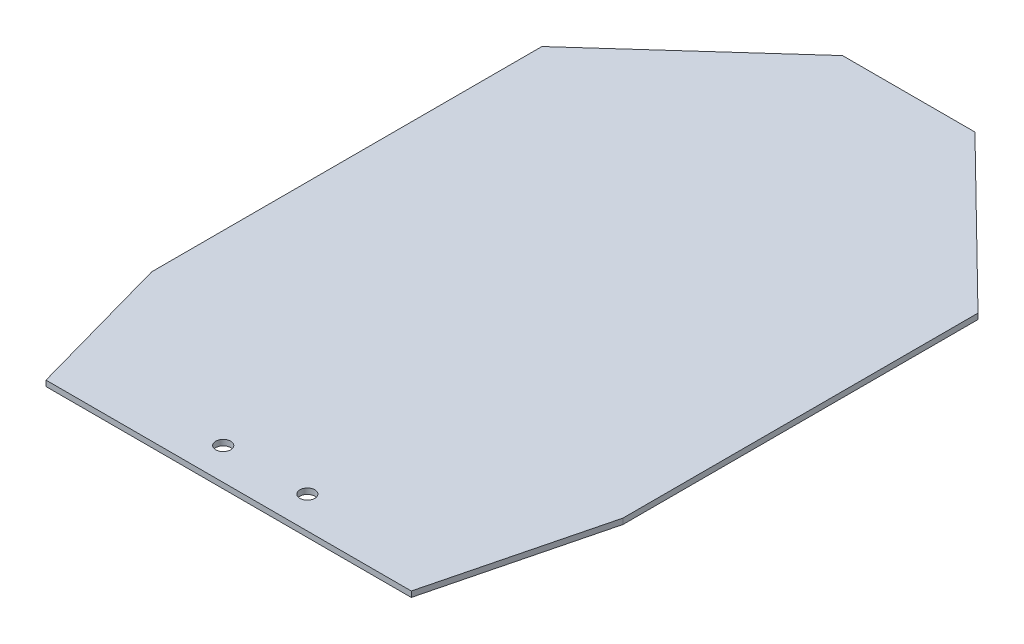
ISO-10303-21;
HEADER;
FILE_DESCRIPTION(('STEP AP214'),'2;1');
FILE_NAME('part.step','',(''),(''),'','','');
FILE_SCHEMA(('AUTOMOTIVE_DESIGN { 1 0 10303 214 1 1 1 1 }'));
ENDSEC;
DATA;
#1=APPLICATION_CONTEXT('core data for automotive mechanical design processes');
#2=APPLICATION_PROTOCOL_DEFINITION('international standard','automotive_design',2000,#1);
#3=PRODUCT_CONTEXT('',#1,'mechanical');
#4=PRODUCT('Part','Part','',(#3));
#5=PRODUCT_RELATED_PRODUCT_CATEGORY('part','',(#4));
#6=PRODUCT_DEFINITION_FORMATION('','',#4);
#7=PRODUCT_DEFINITION_CONTEXT('part definition',#1,'design');
#8=PRODUCT_DEFINITION('design','',#6,#7);
#9=PRODUCT_DEFINITION_SHAPE('','',#8);
#10=(LENGTH_UNIT() NAMED_UNIT(*) SI_UNIT(.MILLI.,.METRE.));
#11=(NAMED_UNIT(*) PLANE_ANGLE_UNIT() SI_UNIT($,.RADIAN.));
#12=(NAMED_UNIT(*) SI_UNIT($,.STERADIAN.) SOLID_ANGLE_UNIT());
#13=UNCERTAINTY_MEASURE_WITH_UNIT(LENGTH_MEASURE(1.E-05),#10,'distance_accuracy_value','');
#14=(GEOMETRIC_REPRESENTATION_CONTEXT(3) GLOBAL_UNCERTAINTY_ASSIGNED_CONTEXT((#13)) GLOBAL_UNIT_ASSIGNED_CONTEXT((#10,
#11,#12)) REPRESENTATION_CONTEXT('',''));
#15=CARTESIAN_POINT('',(0.,0.,0.));
#16=DIRECTION('',(0.,0.,1.));
#17=DIRECTION('',(1.,0.,0.));
#18=AXIS2_PLACEMENT_3D('',#15,#16,#17);
#19=CARTESIAN_POINT('',(120.079758062847,3.,-97.5120654494727));
#20=DIRECTION('',(-0.700151218807144,0.,0.713994587376452));
#21=DIRECTION('',(0.713994587376452,0.,0.700151218807144));
#22=AXIS2_PLACEMENT_3D('',#19,#20,#21);
#23=PLANE('',#22);
#24=DIRECTION('',(-0.713994587376452,0.,-0.700151218807144));
#25=VECTOR('',#24,1.);
#26=CARTESIAN_POINT('',(120.079758062847,0.,-97.5120654494727));
#27=LINE('',#26,#25);
#28=CARTESIAN_POINT('',(120.079758062847,0.,-97.5120654494727));
#29=VERTEX_POINT('',#28);
#30=CARTESIAN_POINT('',(35.4,0.,-180.55));
#31=VERTEX_POINT('',#30);
#32=EDGE_CURVE('E133',#29,#31,#27,.T.);
#33=ORIENTED_EDGE('',*,*,#32,.T.);
#34=DIRECTION('',(0.,-1.,0.));
#35=VECTOR('',#34,1.);
#36=CARTESIAN_POINT('',(35.4,3.,-180.55));
#37=LINE('',#36,#35);
#38=CARTESIAN_POINT('',(35.4,3.,-180.55));
#39=VERTEX_POINT('',#38);
#40=EDGE_CURVE('E11',#39,#31,#37,.T.);
#41=ORIENTED_EDGE('',*,*,#40,.F.);
#42=DIRECTION('',(-0.713994587376452,0.,-0.700151218807144));
#43=VECTOR('',#42,1.);
#44=CARTESIAN_POINT('',(120.079758062847,3.,-97.5120654494727));
#45=LINE('',#44,#43);
#46=CARTESIAN_POINT('',(120.079758062847,3.,-97.5120654494727));
#47=VERTEX_POINT('',#46);
#48=EDGE_CURVE('E148',#47,#39,#45,.T.);
#49=ORIENTED_EDGE('',*,*,#48,.F.);
#50=DIRECTION('',(0.,-1.,0.));
#51=VECTOR('',#50,1.);
#52=CARTESIAN_POINT('',(120.079758062847,3.,-97.5120654494727));
#53=LINE('',#52,#51);
#54=EDGE_CURVE('E129',#47,#29,#53,.T.);
#55=ORIENTED_EDGE('',*,*,#54,.T.);
#56=EDGE_LOOP('',(#33,#41,#49,#55));
#57=FACE_BOUND('',#56,.T.);
#58=ADVANCED_FACE('F37',(#57),#23,.F.);
#59=CARTESIAN_POINT('',(35.4,3.,-180.55));
#60=DIRECTION('',(0.,0.,1.));
#61=DIRECTION('',(1.,0.,0.));
#62=AXIS2_PLACEMENT_3D('',#59,#60,#61);
#63=PLANE('',#62);
#64=DIRECTION('',(-1.,0.,0.));
#65=VECTOR('',#64,1.);
#66=CARTESIAN_POINT('',(35.4,0.,-180.55));
#67=LINE('',#66,#65);
#68=CARTESIAN_POINT('',(-35.4,0.,-180.55));
#69=VERTEX_POINT('',#68);
#70=EDGE_CURVE('E136',#31,#69,#67,.T.);
#71=ORIENTED_EDGE('',*,*,#70,.T.);
#72=DIRECTION('',(0.,-1.,0.));
#73=VECTOR('',#72,1.);
#74=CARTESIAN_POINT('',(-35.4,3.,-180.55));
#75=LINE('',#74,#73);
#76=CARTESIAN_POINT('',(-35.4,3.,-180.55));
#77=VERTEX_POINT('',#76);
#78=EDGE_CURVE('E45',#77,#69,#75,.T.);
#79=ORIENTED_EDGE('',*,*,#78,.F.);
#80=DIRECTION('',(-1.,0.,0.));
#81=VECTOR('',#80,1.);
#82=CARTESIAN_POINT('',(35.4,3.,-180.55));
#83=LINE('',#82,#81);
#84=EDGE_CURVE('E96',#39,#77,#83,.T.);
#85=ORIENTED_EDGE('',*,*,#84,.F.);
#86=ORIENTED_EDGE('',*,*,#40,.T.);
#87=EDGE_LOOP('',(#71,#79,#85,#86));
#88=FACE_BOUND('',#87,.T.);
#89=ADVANCED_FACE('F217',(#88),#63,.F.);
#90=CARTESIAN_POINT('',(-35.4,3.,-180.55));
#91=DIRECTION('',(0.669301712779974,0.,0.742990724888133));
#92=DIRECTION('',(0.742990724888133,0.,-0.669301712779974));
#93=AXIS2_PLACEMENT_3D('',#90,#91,#92);
#94=PLANE('',#93);
#95=DIRECTION('',(-0.742990724888133,0.,0.669301712779974));
#96=VECTOR('',#95,1.);
#97=CARTESIAN_POINT('',(-35.4,0.,-180.55));
#98=LINE('',#97,#96);
#99=CARTESIAN_POINT('',(-119.989494028514,0.,-104.35));
#100=VERTEX_POINT('',#99);
#101=EDGE_CURVE('E139',#69,#100,#98,.T.);
#102=ORIENTED_EDGE('',*,*,#101,.T.);
#103=DIRECTION('',(0.,-1.,0.));
#104=VECTOR('',#103,1.);
#105=CARTESIAN_POINT('',(-119.989494028514,3.,-104.35));
#106=LINE('',#105,#104);
#107=CARTESIAN_POINT('',(-119.989494028514,3.,-104.35));
#108=VERTEX_POINT('',#107);
#109=EDGE_CURVE('E155',#108,#100,#106,.T.);
#110=ORIENTED_EDGE('',*,*,#109,.F.);
#111=DIRECTION('',(-0.742990724888133,0.,0.669301712779974));
#112=VECTOR('',#111,1.);
#113=CARTESIAN_POINT('',(-35.4,3.,-180.55));
#114=LINE('',#113,#112);
#115=EDGE_CURVE('E163',#77,#108,#114,.T.);
#116=ORIENTED_EDGE('',*,*,#115,.F.);
#117=ORIENTED_EDGE('',*,*,#78,.T.);
#118=EDGE_LOOP('',(#102,#110,#116,#117));
#119=FACE_BOUND('',#118,.T.);
#120=ADVANCED_FACE('F161',(#119),#94,.F.);
#121=CARTESIAN_POINT('',(-119.989494028514,3.,-104.35));
#122=DIRECTION('',(1.,0.,0.));
#123=DIRECTION('',(0.,0.,-1.));
#124=AXIS2_PLACEMENT_3D('',#121,#122,#123);
#125=PLANE('',#124);
#126=DIRECTION('',(0.,0.,1.));
#127=VECTOR('',#126,1.);
#128=CARTESIAN_POINT('',(-119.989494028514,0.,-104.35));
#129=LINE('',#128,#127);
#130=CARTESIAN_POINT('',(-119.989494028514,0.,104.35));
#131=VERTEX_POINT('',#130);
#132=EDGE_CURVE('E141',#100,#131,#129,.T.);
#133=ORIENTED_EDGE('',*,*,#132,.T.);
#134=DIRECTION('',(0.,-1.,0.));
#135=VECTOR('',#134,1.);
#136=CARTESIAN_POINT('',(-119.989494028514,3.,104.35));
#137=LINE('',#136,#135);
#138=CARTESIAN_POINT('',(-119.989494028514,3.,104.35));
#139=VERTEX_POINT('',#138);
#140=EDGE_CURVE('E152',#139,#131,#137,.T.);
#141=ORIENTED_EDGE('',*,*,#140,.F.);
#142=DIRECTION('',(0.,0.,1.));
#143=VECTOR('',#142,1.);
#144=CARTESIAN_POINT('',(-119.989494028514,3.,-104.35));
#145=LINE('',#144,#143);
#146=EDGE_CURVE('E175',#108,#139,#145,.T.);
#147=ORIENTED_EDGE('',*,*,#146,.F.);
#148=ORIENTED_EDGE('',*,*,#109,.T.);
#149=EDGE_LOOP('',(#133,#141,#147,#148));
#150=FACE_BOUND('',#149,.T.);
#151=ADVANCED_FACE('F171',(#150),#125,.F.);
#152=CARTESIAN_POINT('',(-119.989494028514,3.,104.35));
#153=DIRECTION('',(0.963144963144963,0.,-0.268982861849016));
#154=DIRECTION('',(-0.268982861849016,0.,-0.963144963144963));
#155=AXIS2_PLACEMENT_3D('',#152,#153,#154);
#156=PLANE('',#155);
#157=DIRECTION('',(0.268982861849016,0.,0.963144963144963));
#158=VECTOR('',#157,1.);
#159=CARTESIAN_POINT('',(-119.989494028514,0.,104.35));
#160=LINE('',#159,#158);
#161=CARTESIAN_POINT('',(-98.094289074004,0.,182.75));
#162=VERTEX_POINT('',#161);
#163=EDGE_CURVE('E143',#131,#162,#160,.T.);
#164=ORIENTED_EDGE('',*,*,#163,.T.);
#165=DIRECTION('',(0.,-1.,0.));
#166=VECTOR('',#165,1.);
#167=CARTESIAN_POINT('',(-98.094289074004,3.,182.75));
#168=LINE('',#167,#166);
#169=CARTESIAN_POINT('',(-98.094289074004,3.,182.75));
#170=VERTEX_POINT('',#169);
#171=EDGE_CURVE('E124',#170,#162,#168,.T.);
#172=ORIENTED_EDGE('',*,*,#171,.F.);
#173=DIRECTION('',(0.268982861849016,0.,0.963144963144963));
#174=VECTOR('',#173,1.);
#175=CARTESIAN_POINT('',(-119.989494028514,3.,104.35));
#176=LINE('',#175,#174);
#177=EDGE_CURVE('E115',#139,#170,#176,.T.);
#178=ORIENTED_EDGE('',*,*,#177,.F.);
#179=ORIENTED_EDGE('',*,*,#140,.T.);
#180=EDGE_LOOP('',(#164,#172,#178,#179));
#181=FACE_BOUND('',#180,.T.);
#182=ADVANCED_FACE('F174',(#181),#156,.F.);
#183=CARTESIAN_POINT('',(-98.094289074004,3.,182.75));
#184=DIRECTION('',(0.,0.,-1.));
#185=DIRECTION('',(-1.,0.,0.));
#186=AXIS2_PLACEMENT_3D('',#183,#184,#185);
#187=PLANE('',#186);
#188=DIRECTION('',(1.,0.,0.));
#189=VECTOR('',#188,1.);
#190=CARTESIAN_POINT('',(-98.094289074004,0.,182.75));
#191=LINE('',#190,#189);
#192=CARTESIAN_POINT('',(97.255710925996,0.,182.75));
#193=VERTEX_POINT('',#192);
#194=EDGE_CURVE('E123',#162,#193,#191,.T.);
#195=ORIENTED_EDGE('',*,*,#194,.T.);
#196=DIRECTION('',(0.,-1.,0.));
#197=VECTOR('',#196,1.);
#198=CARTESIAN_POINT('',(97.255710925996,3.,182.75));
#199=LINE('',#198,#197);
#200=CARTESIAN_POINT('',(97.255710925996,3.,182.75));
#201=VERTEX_POINT('',#200);
#202=EDGE_CURVE('E120',#201,#193,#199,.T.);
#203=ORIENTED_EDGE('',*,*,#202,.F.);
#204=DIRECTION('',(1.,0.,0.));
#205=VECTOR('',#204,1.);
#206=CARTESIAN_POINT('',(-98.094289074004,3.,182.75));
#207=LINE('',#206,#205);
#208=EDGE_CURVE('E109',#170,#201,#207,.T.);
#209=ORIENTED_EDGE('',*,*,#208,.F.);
#210=ORIENTED_EDGE('',*,*,#171,.T.);
#211=EDGE_LOOP('',(#195,#203,#209,#210));
#212=FACE_BOUND('',#211,.T.);
#213=ADVANCED_FACE('F121',(#212),#187,.F.);
#214=CARTESIAN_POINT('',(97.255710925996,3.,182.75));
#215=DIRECTION('',(-0.969550058470737,0.,-0.244893209622867));
#216=DIRECTION('',(-0.244893209622867,0.,0.969550058470737));
#217=AXIS2_PLACEMENT_3D('',#214,#215,#216);
#218=PLANE('',#217);
#219=DIRECTION('',(0.244893209622867,0.,-0.969550058470737));
#220=VECTOR('',#219,1.);
#221=CARTESIAN_POINT('',(97.255710925996,0.,182.75));
#222=LINE('',#221,#220);
#223=CARTESIAN_POINT('',(120.079758062847,0.,92.3879345505273));
#224=VERTEX_POINT('',#223);
#225=EDGE_CURVE('E82',#193,#224,#222,.T.);
#226=ORIENTED_EDGE('',*,*,#225,.T.);
#227=DIRECTION('',(0.,-1.,0.));
#228=VECTOR('',#227,1.);
#229=CARTESIAN_POINT('',(120.079758062847,3.,92.3879345505273));
#230=LINE('',#229,#228);
#231=CARTESIAN_POINT('',(120.079758062847,3.,92.3879345505273));
#232=VERTEX_POINT('',#231);
#233=EDGE_CURVE('E125',#232,#224,#230,.T.);
#234=ORIENTED_EDGE('',*,*,#233,.F.);
#235=DIRECTION('',(0.244893209622867,0.,-0.969550058470737));
#236=VECTOR('',#235,1.);
#237=CARTESIAN_POINT('',(97.255710925996,3.,182.75));
#238=LINE('',#237,#236);
#239=EDGE_CURVE('E113',#201,#232,#238,.T.);
#240=ORIENTED_EDGE('',*,*,#239,.F.);
#241=ORIENTED_EDGE('',*,*,#202,.T.);
#242=EDGE_LOOP('',(#226,#234,#240,#241));
#243=FACE_BOUND('',#242,.T.);
#244=ADVANCED_FACE('F127',(#243),#218,.F.);
#245=CARTESIAN_POINT('',(120.079758062847,3.,92.3879345505273));
#246=DIRECTION('',(-1.,0.,0.));
#247=DIRECTION('',(0.,0.,1.));
#248=AXIS2_PLACEMENT_3D('',#245,#246,#247);
#249=PLANE('',#248);
#250=DIRECTION('',(0.,0.,-1.));
#251=VECTOR('',#250,1.);
#252=CARTESIAN_POINT('',(120.079758062847,0.,92.3879345505273));
#253=LINE('',#252,#251);
#254=EDGE_CURVE('E88',#224,#29,#253,.T.);
#255=ORIENTED_EDGE('',*,*,#254,.T.);
#256=ORIENTED_EDGE('',*,*,#54,.F.);
#257=DIRECTION('',(0.,0.,-1.));
#258=VECTOR('',#257,1.);
#259=CARTESIAN_POINT('',(120.079758062847,3.,92.3879345505273));
#260=LINE('',#259,#258);
#261=EDGE_CURVE('E53',#232,#47,#260,.T.);
#262=ORIENTED_EDGE('',*,*,#261,.F.);
#263=ORIENTED_EDGE('',*,*,#233,.T.);
#264=EDGE_LOOP('',(#255,#256,#262,#263));
#265=FACE_BOUND('',#264,.T.);
#266=ADVANCED_FACE('F204',(#265),#249,.F.);
#267=CARTESIAN_POINT('',(0.,3.,0.));
#268=DIRECTION('',(0.,1.,0.));
#269=DIRECTION('',(0.,0.,1.));
#270=AXIS2_PLACEMENT_3D('',#267,#268,#269);
#271=PLANE('',#270);
#272=CARTESIAN_POINT('',(-20.4202419371528,3.,165.65));
#273=DIRECTION('',(0.,1.,0.));
#274=DIRECTION('',(0.,0.,1.));
#275=AXIS2_PLACEMENT_3D('',#272,#273,#274);
#276=CIRCLE('',#275,4.);
#277=CARTESIAN_POINT('',(-20.4202419371528,3.,169.65));
#278=VERTEX_POINT('',#277);
#279=EDGE_CURVE('E187',#278,#278,#276,.T.);
#280=ORIENTED_EDGE('',*,*,#279,.F.);
#281=EDGE_LOOP('',(#280));
#282=FACE_BOUND('',#281,.T.);
#283=CARTESIAN_POINT('',(24.5797580628472,3.,165.65));
#284=DIRECTION('',(0.,1.,0.));
#285=DIRECTION('',(0.,0.,1.));
#286=AXIS2_PLACEMENT_3D('',#283,#284,#285);
#287=CIRCLE('',#286,4.);
#288=CARTESIAN_POINT('',(24.5797580628472,3.,169.65));
#289=VERTEX_POINT('',#288);
#290=EDGE_CURVE('E181',#289,#289,#287,.T.);
#291=ORIENTED_EDGE('',*,*,#290,.F.);
#292=EDGE_LOOP('',(#291));
#293=FACE_BOUND('',#292,.T.);
#294=ORIENTED_EDGE('',*,*,#48,.T.);
#295=ORIENTED_EDGE('',*,*,#84,.T.);
#296=ORIENTED_EDGE('',*,*,#115,.T.);
#297=ORIENTED_EDGE('',*,*,#146,.T.);
#298=ORIENTED_EDGE('',*,*,#177,.T.);
#299=ORIENTED_EDGE('',*,*,#208,.T.);
#300=ORIENTED_EDGE('',*,*,#239,.T.);
#301=ORIENTED_EDGE('',*,*,#261,.T.);
#302=EDGE_LOOP('',(#294,#295,#296,#297,#298,#299,#300,#301));
#303=FACE_BOUND('',#302,.T.);
#304=ADVANCED_FACE('F111',(#282,#293,#303),#271,.T.);
#305=CARTESIAN_POINT('',(0.,0.,0.));
#306=DIRECTION('',(0.,1.,0.));
#307=DIRECTION('',(0.,0.,1.));
#308=AXIS2_PLACEMENT_3D('',#305,#306,#307);
#309=PLANE('',#308);
#310=CARTESIAN_POINT('',(-20.4202419371528,0.,165.65));
#311=DIRECTION('',(0.,1.,0.));
#312=DIRECTION('',(0.,0.,1.));
#313=AXIS2_PLACEMENT_3D('',#310,#311,#312);
#314=CIRCLE('',#313,4.);
#315=CARTESIAN_POINT('',(-20.4202419371528,0.,169.65));
#316=VERTEX_POINT('',#315);
#317=EDGE_CURVE('E184',#316,#316,#314,.T.);
#318=ORIENTED_EDGE('',*,*,#317,.T.);
#319=EDGE_LOOP('',(#318));
#320=FACE_BOUND('',#319,.T.);
#321=CARTESIAN_POINT('',(24.5797580628472,0.,165.65));
#322=DIRECTION('',(0.,1.,0.));
#323=DIRECTION('',(0.,0.,1.));
#324=AXIS2_PLACEMENT_3D('',#321,#322,#323);
#325=CIRCLE('',#324,4.);
#326=CARTESIAN_POINT('',(24.5797580628472,0.,169.65));
#327=VERTEX_POINT('',#326);
#328=EDGE_CURVE('E137',#327,#327,#325,.T.);
#329=ORIENTED_EDGE('',*,*,#328,.T.);
#330=EDGE_LOOP('',(#329));
#331=FACE_BOUND('',#330,.T.);
#332=ORIENTED_EDGE('',*,*,#32,.F.);
#333=ORIENTED_EDGE('',*,*,#254,.F.);
#334=ORIENTED_EDGE('',*,*,#225,.F.);
#335=ORIENTED_EDGE('',*,*,#194,.F.);
#336=ORIENTED_EDGE('',*,*,#163,.F.);
#337=ORIENTED_EDGE('',*,*,#132,.F.);
#338=ORIENTED_EDGE('',*,*,#101,.F.);
#339=ORIENTED_EDGE('',*,*,#70,.F.);
#340=EDGE_LOOP('',(#332,#333,#334,#335,#336,#337,#338,#339));
#341=FACE_BOUND('',#340,.T.);
#342=ADVANCED_FACE('F167',(#320,#331,#341),#309,.F.);
#343=CARTESIAN_POINT('',(24.5797580628472,0.,165.65));
#344=DIRECTION('',(0.,1.,0.));
#345=DIRECTION('',(0.,0.,1.));
#346=AXIS2_PLACEMENT_3D('',#343,#344,#345);
#347=CYLINDRICAL_SURFACE('',#346,4.);
#348=ORIENTED_EDGE('',*,*,#328,.F.);
#349=EDGE_LOOP('',(#348));
#350=FACE_BOUND('',#349,.T.);
#351=ORIENTED_EDGE('',*,*,#290,.T.);
#352=EDGE_LOOP('',(#351));
#353=FACE_BOUND('',#352,.T.);
#354=ADVANCED_FACE('F198',(#350,#353),#347,.F.);
#355=CARTESIAN_POINT('',(-20.4202419371528,0.,165.65));
#356=DIRECTION('',(0.,1.,0.));
#357=DIRECTION('',(0.,0.,1.));
#358=AXIS2_PLACEMENT_3D('',#355,#356,#357);
#359=CYLINDRICAL_SURFACE('',#358,4.);
#360=ORIENTED_EDGE('',*,*,#317,.F.);
#361=EDGE_LOOP('',(#360));
#362=FACE_BOUND('',#361,.T.);
#363=ORIENTED_EDGE('',*,*,#279,.T.);
#364=EDGE_LOOP('',(#363));
#365=FACE_BOUND('',#364,.T.);
#366=ADVANCED_FACE('F195',(#362,#365),#359,.F.);
#367=CLOSED_SHELL('',(#58,#89,#120,#151,#182,#213,#244,#266,#304,#342,#354,#366));
#368=MANIFOLD_SOLID_BREP('B2',#367);
#369=ADVANCED_BREP_SHAPE_REPRESENTATION('',(#18,#368),#14);
#370=SHAPE_DEFINITION_REPRESENTATION(#9,#369);
ENDSEC;
END-ISO-10303-21;
